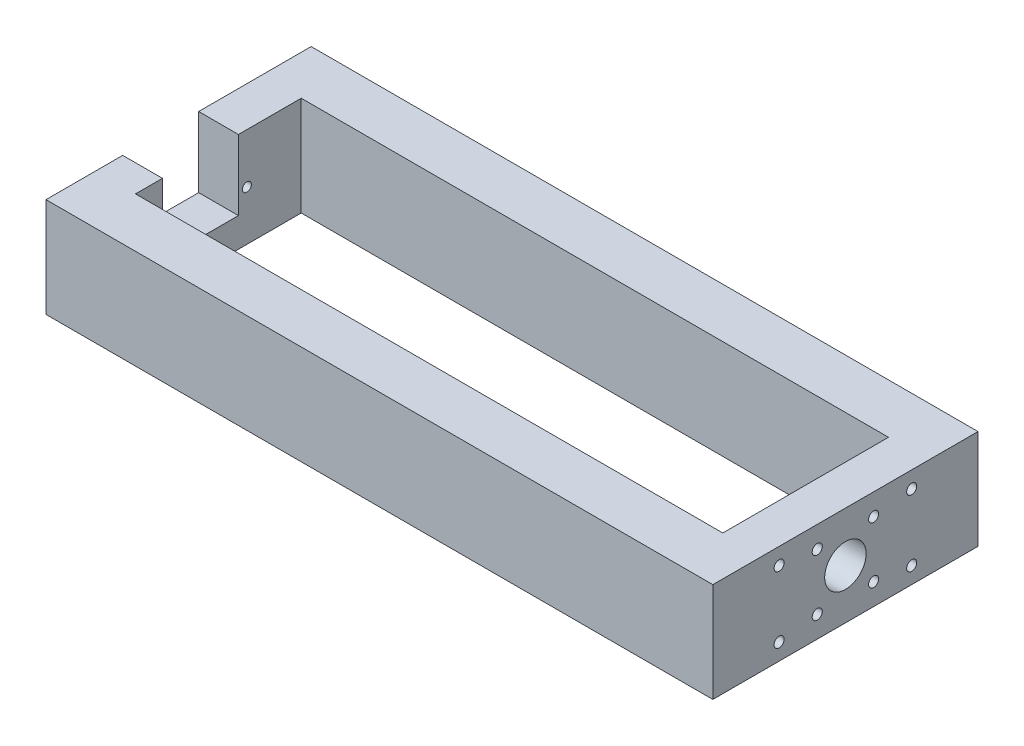
ISO-10303-21;
HEADER;
FILE_DESCRIPTION(('STEP AP214'),'2;1');
FILE_NAME('part.step','',(''),(''),'','','');
FILE_SCHEMA(('AUTOMOTIVE_DESIGN { 1 0 10303 214 1 1 1 1 }'));
ENDSEC;
DATA;
#1=APPLICATION_CONTEXT('core data for automotive mechanical design processes');
#2=APPLICATION_PROTOCOL_DEFINITION('international standard','automotive_design',2000,#1);
#3=PRODUCT_CONTEXT('',#1,'mechanical');
#4=PRODUCT('Part','Part','',(#3));
#5=PRODUCT_RELATED_PRODUCT_CATEGORY('part','',(#4));
#6=PRODUCT_DEFINITION_FORMATION('','',#4);
#7=PRODUCT_DEFINITION_CONTEXT('part definition',#1,'design');
#8=PRODUCT_DEFINITION('design','',#6,#7);
#9=PRODUCT_DEFINITION_SHAPE('','',#8);
#10=(LENGTH_UNIT() NAMED_UNIT(*) SI_UNIT(.MILLI.,.METRE.));
#11=(NAMED_UNIT(*) PLANE_ANGLE_UNIT() SI_UNIT($,.RADIAN.));
#12=(NAMED_UNIT(*) SI_UNIT($,.STERADIAN.) SOLID_ANGLE_UNIT());
#13=UNCERTAINTY_MEASURE_WITH_UNIT(LENGTH_MEASURE(1.E-05),#10,'distance_accuracy_value','');
#14=(GEOMETRIC_REPRESENTATION_CONTEXT(3) GLOBAL_UNCERTAINTY_ASSIGNED_CONTEXT((#13)) GLOBAL_UNIT_ASSIGNED_CONTEXT((#10,
#11,#12)) REPRESENTATION_CONTEXT('',''));
#15=CARTESIAN_POINT('',(0.,0.,0.));
#16=DIRECTION('',(0.,0.,1.));
#17=DIRECTION('',(1.,0.,0.));
#18=AXIS2_PLACEMENT_3D('',#15,#16,#17);
#19=CARTESIAN_POINT('',(0.,30.,0.));
#20=DIRECTION('',(0.,1.,0.));
#21=DIRECTION('',(0.,0.,1.));
#22=AXIS2_PLACEMENT_3D('',#19,#20,#21);
#23=PLANE('',#22);
#24=DIRECTION('',(-1.,0.,0.));
#25=VECTOR('',#24,1.);
#26=CARTESIAN_POINT('',(-39.9651121794872,30.,13.4663381410256));
#27=LINE('',#26,#25);
#28=CARTESIAN_POINT('',(-57.9651121794872,30.,13.4663381410256));
#29=VERTEX_POINT('',#28);
#30=CARTESIAN_POINT('',(-69.9651121794872,30.,13.4663381410256));
#31=VERTEX_POINT('',#30);
#32=EDGE_CURVE('E151',#29,#31,#27,.T.);
#33=ORIENTED_EDGE('',*,*,#32,.F.);
#34=DIRECTION('',(0.,0.,1.));
#35=VECTOR('',#34,1.);
#36=CARTESIAN_POINT('',(-57.9651121794872,30.,-5.47366185897436));
#37=LINE('',#36,#35);
#38=CARTESIAN_POINT('',(-57.9651121794872,30.,-5.47366185897436));
#39=VERTEX_POINT('',#38);
#40=EDGE_CURVE('E174',#39,#29,#37,.T.);
#41=ORIENTED_EDGE('',*,*,#40,.F.);
#42=DIRECTION('',(-1.,0.,0.));
#43=VECTOR('',#42,1.);
#44=CARTESIAN_POINT('',(-57.9651121794872,30.,-5.47366185897436));
#45=LINE('',#44,#43);
#46=CARTESIAN_POINT('',(119.224887820513,30.,-5.47366185897436));
#47=VERTEX_POINT('',#46);
#48=EDGE_CURVE('E185',#47,#39,#45,.T.);
#49=ORIENTED_EDGE('',*,*,#48,.F.);
#50=DIRECTION('',(0.,0.,-1.));
#51=VECTOR('',#50,1.);
#52=CARTESIAN_POINT('',(119.224887820513,30.,-5.47366185897436));
#53=LINE('',#52,#51);
#54=CARTESIAN_POINT('',(119.224887820513,30.,44.5263381410256));
#55=VERTEX_POINT('',#54);
#56=EDGE_CURVE('E182',#55,#47,#53,.T.);
#57=ORIENTED_EDGE('',*,*,#56,.F.);
#58=DIRECTION('',(1.,0.,0.));
#59=VECTOR('',#58,1.);
#60=CARTESIAN_POINT('',(-57.9651121794872,30.,44.5263381410256));
#61=LINE('',#60,#59);
#62=CARTESIAN_POINT('',(-57.9651121794872,30.,44.5263381410256));
#63=VERTEX_POINT('',#62);
#64=EDGE_CURVE('E178',#63,#55,#61,.T.);
#65=ORIENTED_EDGE('',*,*,#64,.F.);
#66=CARTESIAN_POINT('',(-57.9651121794872,30.,36.3863381410256));
#67=VERTEX_POINT('',#66);
#68=EDGE_CURVE('E179',#67,#63,#37,.T.);
#69=ORIENTED_EDGE('',*,*,#68,.F.);
#70=DIRECTION('',(-1.,0.,0.));
#71=VECTOR('',#70,1.);
#72=CARTESIAN_POINT('',(-39.9651121794872,30.,36.3863381410256));
#73=LINE('',#72,#71);
#74=CARTESIAN_POINT('',(-69.9651121794872,30.,36.3863381410256));
#75=VERTEX_POINT('',#74);
#76=EDGE_CURVE('E168',#67,#75,#73,.T.);
#77=ORIENTED_EDGE('',*,*,#76,.T.);
#78=DIRECTION('',(0.,0.,1.));
#79=VECTOR('',#78,1.);
#80=CARTESIAN_POINT('',(-69.9651121794872,30.,-20.4736618589744));
#81=LINE('',#80,#79);
#82=CARTESIAN_POINT('',(-69.9651121794872,30.,59.5263381410256));
#83=VERTEX_POINT('',#82);
#84=EDGE_CURVE('E223',#75,#83,#81,.T.);
#85=ORIENTED_EDGE('',*,*,#84,.T.);
#86=DIRECTION('',(1.,0.,0.));
#87=VECTOR('',#86,1.);
#88=CARTESIAN_POINT('',(-69.9651121794872,30.,59.5263381410256));
#89=LINE('',#88,#87);
#90=CARTESIAN_POINT('',(131.224887820513,30.,59.5263381410256));
#91=VERTEX_POINT('',#90);
#92=EDGE_CURVE('E222',#83,#91,#89,.T.);
#93=ORIENTED_EDGE('',*,*,#92,.T.);
#94=DIRECTION('',(0.,0.,-1.));
#95=VECTOR('',#94,1.);
#96=CARTESIAN_POINT('',(131.224887820513,30.,-20.4736618589744));
#97=LINE('',#96,#95);
#98=CARTESIAN_POINT('',(131.224887820513,30.,-20.4736618589744));
#99=VERTEX_POINT('',#98);
#100=EDGE_CURVE('E226',#91,#99,#97,.T.);
#101=ORIENTED_EDGE('',*,*,#100,.T.);
#102=DIRECTION('',(-1.,0.,0.));
#103=VECTOR('',#102,1.);
#104=CARTESIAN_POINT('',(-69.9651121794872,30.,-20.4736618589744));
#105=LINE('',#104,#103);
#106=CARTESIAN_POINT('',(-69.9651121794872,30.,-20.4736618589744));
#107=VERTEX_POINT('',#106);
#108=EDGE_CURVE('E229',#99,#107,#105,.T.);
#109=ORIENTED_EDGE('',*,*,#108,.T.);
#110=EDGE_CURVE('E219',#107,#31,#81,.T.);
#111=ORIENTED_EDGE('',*,*,#110,.T.);
#112=EDGE_LOOP('',(#33,#41,#49,#57,#65,#69,#77,#85,#93,#101,#109,#111));
#113=FACE_BOUND('',#112,.T.);
#114=ADVANCED_FACE('F45',(#113),#23,.T.);
#115=CARTESIAN_POINT('',(0.,0.,0.));
#116=DIRECTION('',(0.,1.,0.));
#117=DIRECTION('',(0.,0.,1.));
#118=AXIS2_PLACEMENT_3D('',#115,#116,#117);
#119=PLANE('',#118);
#120=DIRECTION('',(0.,0.,1.));
#121=VECTOR('',#120,1.);
#122=CARTESIAN_POINT('',(-69.9651121794872,0.,-20.4736618589744));
#123=LINE('',#122,#121);
#124=CARTESIAN_POINT('',(-69.9651121794872,0.,-20.4736618589744));
#125=VERTEX_POINT('',#124);
#126=CARTESIAN_POINT('',(-69.9651121794872,0.,59.5263381410256));
#127=VERTEX_POINT('',#126);
#128=EDGE_CURVE('E218',#125,#127,#123,.T.);
#129=ORIENTED_EDGE('',*,*,#128,.F.);
#130=DIRECTION('',(-1.,0.,0.));
#131=VECTOR('',#130,1.);
#132=CARTESIAN_POINT('',(-69.9651121794872,0.,-20.4736618589744));
#133=LINE('',#132,#131);
#134=CARTESIAN_POINT('',(131.224887820513,0.,-20.4736618589744));
#135=VERTEX_POINT('',#134);
#136=EDGE_CURVE('E242',#135,#125,#133,.T.);
#137=ORIENTED_EDGE('',*,*,#136,.F.);
#138=DIRECTION('',(0.,0.,-1.));
#139=VECTOR('',#138,1.);
#140=CARTESIAN_POINT('',(131.224887820513,0.,-20.4736618589744));
#141=LINE('',#140,#139);
#142=CARTESIAN_POINT('',(131.224887820513,0.,59.5263381410256));
#143=VERTEX_POINT('',#142);
#144=EDGE_CURVE('E239',#143,#135,#141,.T.);
#145=ORIENTED_EDGE('',*,*,#144,.F.);
#146=DIRECTION('',(1.,0.,0.));
#147=VECTOR('',#146,1.);
#148=CARTESIAN_POINT('',(-69.9651121794872,0.,59.5263381410256));
#149=LINE('',#148,#147);
#150=EDGE_CURVE('E236',#127,#143,#149,.T.);
#151=ORIENTED_EDGE('',*,*,#150,.F.);
#152=EDGE_LOOP('',(#129,#137,#145,#151));
#153=FACE_BOUND('',#152,.T.);
#154=DIRECTION('',(0.,0.,1.));
#155=VECTOR('',#154,1.);
#156=CARTESIAN_POINT('',(-57.9651121794872,0.,-5.47366185897436));
#157=LINE('',#156,#155);
#158=CARTESIAN_POINT('',(-57.9651121794872,0.,-5.47366185897436));
#159=VERTEX_POINT('',#158);
#160=CARTESIAN_POINT('',(-57.9651121794872,0.,44.5263381410256));
#161=VERTEX_POINT('',#160);
#162=EDGE_CURVE('E189',#159,#161,#157,.T.);
#163=ORIENTED_EDGE('',*,*,#162,.T.);
#164=DIRECTION('',(1.,0.,0.));
#165=VECTOR('',#164,1.);
#166=CARTESIAN_POINT('',(-57.9651121794872,0.,44.5263381410256));
#167=LINE('',#166,#165);
#168=CARTESIAN_POINT('',(119.224887820513,0.,44.5263381410256));
#169=VERTEX_POINT('',#168);
#170=EDGE_CURVE('E193',#161,#169,#167,.T.);
#171=ORIENTED_EDGE('',*,*,#170,.T.);
#172=DIRECTION('',(0.,0.,-1.));
#173=VECTOR('',#172,1.);
#174=CARTESIAN_POINT('',(119.224887820513,0.,-5.47366185897436));
#175=LINE('',#174,#173);
#176=CARTESIAN_POINT('',(119.224887820513,0.,-5.47366185897436));
#177=VERTEX_POINT('',#176);
#178=EDGE_CURVE('E198',#169,#177,#175,.T.);
#179=ORIENTED_EDGE('',*,*,#178,.T.);
#180=DIRECTION('',(-1.,0.,0.));
#181=VECTOR('',#180,1.);
#182=CARTESIAN_POINT('',(-57.9651121794872,0.,-5.47366185897436));
#183=LINE('',#182,#181);
#184=EDGE_CURVE('E202',#177,#159,#183,.T.);
#185=ORIENTED_EDGE('',*,*,#184,.T.);
#186=EDGE_LOOP('',(#163,#171,#179,#185));
#187=FACE_BOUND('',#186,.T.);
#188=ADVANCED_FACE('F379',(#153,#187),#119,.F.);
#189=CARTESIAN_POINT('',(-69.9651121794872,30.,-20.4736618589744));
#190=DIRECTION('',(1.,0.,0.));
#191=DIRECTION('',(0.,0.,-1.));
#192=AXIS2_PLACEMENT_3D('',#189,#190,#191);
#193=PLANE('',#192);
#194=CARTESIAN_POINT('',(-69.9651121794872,15.,38.9263381410256));
#195=DIRECTION('',(-1.,0.,0.));
#196=DIRECTION('',(0.,0.,1.));
#197=AXIS2_PLACEMENT_3D('',#194,#195,#196);
#198=CIRCLE('',#197,1.35);
#199=CARTESIAN_POINT('',(-69.9651121794872,15.,40.2763381410256));
#200=VERTEX_POINT('',#199);
#201=EDGE_CURVE('E305',#200,#200,#198,.T.);
#202=ORIENTED_EDGE('',*,*,#201,.F.);
#203=EDGE_LOOP('',(#202));
#204=FACE_BOUND('',#203,.T.);
#205=CARTESIAN_POINT('',(-69.9651121794872,15.,10.9263381410256));
#206=DIRECTION('',(-1.,0.,0.));
#207=DIRECTION('',(0.,0.,1.));
#208=AXIS2_PLACEMENT_3D('',#205,#206,#207);
#209=CIRCLE('',#208,1.35);
#210=CARTESIAN_POINT('',(-69.9651121794872,15.,12.2763381410256));
#211=VERTEX_POINT('',#210);
#212=EDGE_CURVE('E156',#211,#211,#209,.T.);
#213=ORIENTED_EDGE('',*,*,#212,.F.);
#214=EDGE_LOOP('',(#213));
#215=FACE_BOUND('',#214,.T.);
#216=DIRECTION('',(0.,0.,1.));
#217=VECTOR('',#216,1.);
#218=CARTESIAN_POINT('',(-69.9651121794872,8.8,13.4663381410256));
#219=LINE('',#218,#217);
#220=CARTESIAN_POINT('',(-69.9651121794872,8.8,13.4663381410256));
#221=VERTEX_POINT('',#220);
#222=CARTESIAN_POINT('',(-69.9651121794872,8.8,36.3863381410257));
#223=VERTEX_POINT('',#222);
#224=EDGE_CURVE('E138',#221,#223,#219,.T.);
#225=ORIENTED_EDGE('',*,*,#224,.F.);
#226=DIRECTION('',(0.,-1.,0.));
#227=VECTOR('',#226,1.);
#228=CARTESIAN_POINT('',(-69.9651121794872,30.,13.4663381410256));
#229=LINE('',#228,#227);
#230=EDGE_CURVE('E148',#31,#221,#229,.T.);
#231=ORIENTED_EDGE('',*,*,#230,.F.);
#232=ORIENTED_EDGE('',*,*,#110,.F.);
#233=DIRECTION('',(0.,-1.,0.));
#234=VECTOR('',#233,1.);
#235=CARTESIAN_POINT('',(-69.9651121794872,30.,-20.4736618589744));
#236=LINE('',#235,#234);
#237=EDGE_CURVE('E232',#107,#125,#236,.T.);
#238=ORIENTED_EDGE('',*,*,#237,.T.);
#239=ORIENTED_EDGE('',*,*,#128,.T.);
#240=DIRECTION('',(0.,-1.,0.));
#241=VECTOR('',#240,1.);
#242=CARTESIAN_POINT('',(-69.9651121794872,30.,59.5263381410256));
#243=LINE('',#242,#241);
#244=EDGE_CURVE('E256',#83,#127,#243,.T.);
#245=ORIENTED_EDGE('',*,*,#244,.F.);
#246=ORIENTED_EDGE('',*,*,#84,.F.);
#247=DIRECTION('',(0.,1.,0.));
#248=VECTOR('',#247,1.);
#249=CARTESIAN_POINT('',(-69.9651121794872,30.,36.3863381410256));
#250=LINE('',#249,#248);
#251=EDGE_CURVE('E145',#223,#75,#250,.T.);
#252=ORIENTED_EDGE('',*,*,#251,.F.);
#253=EDGE_LOOP('',(#225,#231,#232,#238,#239,#245,#246,#252));
#254=FACE_BOUND('',#253,.T.);
#255=ADVANCED_FACE('F47',(#204,#215,#254),#193,.F.);
#256=CARTESIAN_POINT('',(-69.9651121794872,30.,59.5263381410256));
#257=DIRECTION('',(0.,0.,-1.));
#258=DIRECTION('',(-1.,0.,0.));
#259=AXIS2_PLACEMENT_3D('',#256,#257,#258);
#260=PLANE('',#259);
#261=ORIENTED_EDGE('',*,*,#150,.T.);
#262=DIRECTION('',(0.,-1.,0.));
#263=VECTOR('',#262,1.);
#264=CARTESIAN_POINT('',(131.224887820513,30.,59.5263381410256));
#265=LINE('',#264,#263);
#266=EDGE_CURVE('E252',#91,#143,#265,.T.);
#267=ORIENTED_EDGE('',*,*,#266,.F.);
#268=ORIENTED_EDGE('',*,*,#92,.F.);
#269=ORIENTED_EDGE('',*,*,#244,.T.);
#270=EDGE_LOOP('',(#261,#267,#268,#269));
#271=FACE_BOUND('',#270,.T.);
#272=ADVANCED_FACE('F358',(#271),#260,.F.);
#273=CARTESIAN_POINT('',(131.224887820513,30.,-20.4736618589744));
#274=DIRECTION('',(-1.,0.,0.));
#275=DIRECTION('',(0.,0.,1.));
#276=AXIS2_PLACEMENT_3D('',#273,#274,#275);
#277=PLANE('',#276);
#278=CARTESIAN_POINT('',(131.224887820513,6.50000000000018,11.0263381410255));
#279=DIRECTION('',(1.,0.,0.));
#280=DIRECTION('',(0.,0.,-1.));
#281=AXIS2_PLACEMENT_3D('',#278,#279,#280);
#282=CIRCLE('',#281,1.52);
#283=CARTESIAN_POINT('',(131.224887820513,6.50000000000018,9.50633814102547));
#284=VERTEX_POINT('',#283);
#285=EDGE_CURVE('E328',#284,#284,#282,.T.);
#286=ORIENTED_EDGE('',*,*,#285,.F.);
#287=EDGE_LOOP('',(#286));
#288=FACE_BOUND('',#287,.T.);
#289=CARTESIAN_POINT('',(131.224887820513,23.5000000000002,11.0263381410256));
#290=DIRECTION('',(1.,0.,0.));
#291=DIRECTION('',(0.,0.,-1.));
#292=AXIS2_PLACEMENT_3D('',#289,#290,#291);
#293=CIRCLE('',#292,1.52);
#294=CARTESIAN_POINT('',(131.224887820513,23.5000000000002,9.50633814102562));
#295=VERTEX_POINT('',#294);
#296=EDGE_CURVE('E324',#295,#295,#293,.T.);
#297=ORIENTED_EDGE('',*,*,#296,.F.);
#298=EDGE_LOOP('',(#297));
#299=FACE_BOUND('',#298,.T.);
#300=CARTESIAN_POINT('',(131.224887820513,25.,-0.473661858974354));
#301=DIRECTION('',(1.,0.,0.));
#302=DIRECTION('',(0.,0.,-1.));
#303=AXIS2_PLACEMENT_3D('',#300,#301,#302);
#304=CIRCLE('',#303,1.52);
#305=CARTESIAN_POINT('',(131.224887820513,25.,-1.99366185897436));
#306=VERTEX_POINT('',#305);
#307=EDGE_CURVE('E320',#306,#306,#304,.T.);
#308=ORIENTED_EDGE('',*,*,#307,.F.);
#309=EDGE_LOOP('',(#308));
#310=FACE_BOUND('',#309,.T.);
#311=CARTESIAN_POINT('',(131.224887820513,23.5,28.0263381410256));
#312=DIRECTION('',(1.,0.,0.));
#313=DIRECTION('',(0.,0.,-1.));
#314=AXIS2_PLACEMENT_3D('',#311,#312,#313);
#315=CIRCLE('',#314,1.52);
#316=CARTESIAN_POINT('',(131.224887820513,23.5,26.5063381410256));
#317=VERTEX_POINT('',#316);
#318=EDGE_CURVE('E319',#317,#317,#315,.T.);
#319=ORIENTED_EDGE('',*,*,#318,.F.);
#320=EDGE_LOOP('',(#319));
#321=FACE_BOUND('',#320,.T.);
#322=CARTESIAN_POINT('',(131.224887820513,6.50000000000008,28.0263381410255));
#323=DIRECTION('',(1.,0.,0.));
#324=DIRECTION('',(0.,0.,-1.));
#325=AXIS2_PLACEMENT_3D('',#322,#323,#324);
#326=CIRCLE('',#325,1.52);
#327=CARTESIAN_POINT('',(131.224887820513,6.50000000000008,26.5063381410255));
#328=VERTEX_POINT('',#327);
#329=EDGE_CURVE('E332',#328,#328,#326,.T.);
#330=ORIENTED_EDGE('',*,*,#329,.F.);
#331=EDGE_LOOP('',(#330));
#332=FACE_BOUND('',#331,.T.);
#333=CARTESIAN_POINT('',(131.224887820513,5.,-0.473661858974354));
#334=DIRECTION('',(1.,0.,0.));
#335=DIRECTION('',(0.,0.,-1.));
#336=AXIS2_PLACEMENT_3D('',#333,#334,#335);
#337=CIRCLE('',#336,1.52);
#338=CARTESIAN_POINT('',(131.224887820513,5.,-1.99366185897435));
#339=VERTEX_POINT('',#338);
#340=EDGE_CURVE('E344',#339,#339,#337,.T.);
#341=ORIENTED_EDGE('',*,*,#340,.F.);
#342=EDGE_LOOP('',(#341));
#343=FACE_BOUND('',#342,.T.);
#344=CARTESIAN_POINT('',(131.224887820513,4.99999999999786,39.5263381410246));
#345=DIRECTION('',(1.,0.,0.));
#346=DIRECTION('',(0.,0.,-1.));
#347=AXIS2_PLACEMENT_3D('',#344,#345,#346);
#348=CIRCLE('',#347,1.52);
#349=CARTESIAN_POINT('',(131.224887820513,4.99999999999786,38.0063381410246));
#350=VERTEX_POINT('',#349);
#351=EDGE_CURVE('E340',#350,#350,#348,.T.);
#352=ORIENTED_EDGE('',*,*,#351,.F.);
#353=EDGE_LOOP('',(#352));
#354=FACE_BOUND('',#353,.T.);
#355=CARTESIAN_POINT('',(131.224887820513,24.9999999999979,39.5263381410267));
#356=DIRECTION('',(1.,0.,0.));
#357=DIRECTION('',(0.,0.,-1.));
#358=AXIS2_PLACEMENT_3D('',#355,#356,#357);
#359=CIRCLE('',#358,1.51999999999787);
#360=CARTESIAN_POINT('',(131.224887820513,24.9999999999979,38.0063381410288));
#361=VERTEX_POINT('',#360);
#362=EDGE_CURVE('E336',#361,#361,#359,.T.);
#363=ORIENTED_EDGE('',*,*,#362,.F.);
#364=EDGE_LOOP('',(#363));
#365=FACE_BOUND('',#364,.T.);
#366=CARTESIAN_POINT('',(131.224887820513,15.,19.5263381410256));
#367=DIRECTION('',(1.,0.,0.));
#368=DIRECTION('',(0.,0.,-1.));
#369=AXIS2_PLACEMENT_3D('',#366,#367,#368);
#370=CIRCLE('',#369,6.25);
#371=CARTESIAN_POINT('',(131.224887820513,15.,13.2763381410256));
#372=VERTEX_POINT('',#371);
#373=EDGE_CURVE('E275',#372,#372,#370,.T.);
#374=ORIENTED_EDGE('',*,*,#373,.F.);
#375=EDGE_LOOP('',(#374));
#376=FACE_BOUND('',#375,.T.);
#377=ORIENTED_EDGE('',*,*,#144,.T.);
#378=DIRECTION('',(0.,-1.,0.));
#379=VECTOR('',#378,1.);
#380=CARTESIAN_POINT('',(131.224887820513,30.,-20.4736618589744));
#381=LINE('',#380,#379);
#382=EDGE_CURVE('E248',#99,#135,#381,.T.);
#383=ORIENTED_EDGE('',*,*,#382,.F.);
#384=ORIENTED_EDGE('',*,*,#100,.F.);
#385=ORIENTED_EDGE('',*,*,#266,.T.);
#386=EDGE_LOOP('',(#377,#383,#384,#385));
#387=FACE_BOUND('',#386,.T.);
#388=ADVANCED_FACE('F354',(#288,#299,#310,#321,#332,#343,#354,#365,#376,#387),#277,.F.);
#389=CARTESIAN_POINT('',(-69.9651121794872,30.,-20.4736618589744));
#390=DIRECTION('',(0.,0.,1.));
#391=DIRECTION('',(1.,0.,0.));
#392=AXIS2_PLACEMENT_3D('',#389,#390,#391);
#393=PLANE('',#392);
#394=ORIENTED_EDGE('',*,*,#136,.T.);
#395=ORIENTED_EDGE('',*,*,#237,.F.);
#396=ORIENTED_EDGE('',*,*,#108,.F.);
#397=ORIENTED_EDGE('',*,*,#382,.T.);
#398=EDGE_LOOP('',(#394,#395,#396,#397));
#399=FACE_BOUND('',#398,.T.);
#400=ADVANCED_FACE('F357',(#399),#393,.F.);
#401=CARTESIAN_POINT('',(-57.9651121794872,30.,-5.47366185897436));
#402=DIRECTION('',(1.,0.,0.));
#403=DIRECTION('',(0.,0.,-1.));
#404=AXIS2_PLACEMENT_3D('',#401,#402,#403);
#405=PLANE('',#404);
#406=CARTESIAN_POINT('',(-57.9651121794872,15.,38.9263381410256));
#407=DIRECTION('',(1.,0.,0.));
#408=DIRECTION('',(0.,0.,-1.));
#409=AXIS2_PLACEMENT_3D('',#406,#407,#408);
#410=CIRCLE('',#409,1.35);
#411=CARTESIAN_POINT('',(-57.9651121794872,15.,37.5763381410256));
#412=VERTEX_POINT('',#411);
#413=EDGE_CURVE('E194',#412,#412,#410,.T.);
#414=ORIENTED_EDGE('',*,*,#413,.F.);
#415=EDGE_LOOP('',(#414));
#416=FACE_BOUND('',#415,.T.);
#417=CARTESIAN_POINT('',(-57.9651121794872,15.,10.9263381410256));
#418=DIRECTION('',(1.,0.,0.));
#419=DIRECTION('',(0.,0.,-1.));
#420=AXIS2_PLACEMENT_3D('',#417,#418,#419);
#421=CIRCLE('',#420,1.35);
#422=CARTESIAN_POINT('',(-57.9651121794872,15.,9.57633814102564));
#423=VERTEX_POINT('',#422);
#424=EDGE_CURVE('E167',#423,#423,#421,.T.);
#425=ORIENTED_EDGE('',*,*,#424,.F.);
#426=EDGE_LOOP('',(#425));
#427=FACE_BOUND('',#426,.T.);
#428=DIRECTION('',(0.,1.,0.));
#429=VECTOR('',#428,1.);
#430=CARTESIAN_POINT('',(-57.9651121794872,30.,13.4663381410256));
#431=LINE('',#430,#429);
#432=CARTESIAN_POINT('',(-57.9651121794872,8.8,13.4663381410256));
#433=VERTEX_POINT('',#432);
#434=EDGE_CURVE('E11',#433,#29,#431,.T.);
#435=ORIENTED_EDGE('',*,*,#434,.F.);
#436=DIRECTION('',(0.,0.,-1.));
#437=VECTOR('',#436,1.);
#438=CARTESIAN_POINT('',(-57.9651121794872,8.8,-5.47366185897436));
#439=LINE('',#438,#437);
#440=CARTESIAN_POINT('',(-57.9651121794872,8.8,36.3863381410257));
#441=VERTEX_POINT('',#440);
#442=EDGE_CURVE('E141',#441,#433,#439,.T.);
#443=ORIENTED_EDGE('',*,*,#442,.F.);
#444=DIRECTION('',(0.,-1.,0.));
#445=VECTOR('',#444,1.);
#446=CARTESIAN_POINT('',(-57.9651121794872,30.,36.3863381410256));
#447=LINE('',#446,#445);
#448=EDGE_CURVE('E55',#67,#441,#447,.T.);
#449=ORIENTED_EDGE('',*,*,#448,.F.);
#450=ORIENTED_EDGE('',*,*,#68,.T.);
#451=DIRECTION('',(0.,-1.,0.));
#452=VECTOR('',#451,1.);
#453=CARTESIAN_POINT('',(-57.9651121794872,30.,44.5263381410256));
#454=LINE('',#453,#452);
#455=EDGE_CURVE('E214',#63,#161,#454,.T.);
#456=ORIENTED_EDGE('',*,*,#455,.T.);
#457=ORIENTED_EDGE('',*,*,#162,.F.);
#458=DIRECTION('',(0.,-1.,0.));
#459=VECTOR('',#458,1.);
#460=CARTESIAN_POINT('',(-57.9651121794872,30.,-5.47366185897436));
#461=LINE('',#460,#459);
#462=EDGE_CURVE('E188',#39,#159,#461,.T.);
#463=ORIENTED_EDGE('',*,*,#462,.F.);
#464=ORIENTED_EDGE('',*,*,#40,.T.);
#465=EDGE_LOOP('',(#435,#443,#449,#450,#456,#457,#463,#464));
#466=FACE_BOUND('',#465,.T.);
#467=ADVANCED_FACE('F400',(#416,#427,#466),#405,.T.);
#468=CARTESIAN_POINT('',(-57.9651121794872,30.,44.5263381410256));
#469=DIRECTION('',(0.,0.,-1.));
#470=DIRECTION('',(-1.,0.,0.));
#471=AXIS2_PLACEMENT_3D('',#468,#469,#470);
#472=PLANE('',#471);
#473=ORIENTED_EDGE('',*,*,#170,.F.);
#474=ORIENTED_EDGE('',*,*,#455,.F.);
#475=ORIENTED_EDGE('',*,*,#64,.T.);
#476=DIRECTION('',(0.,-1.,0.));
#477=VECTOR('',#476,1.);
#478=CARTESIAN_POINT('',(119.224887820513,30.,44.5263381410256));
#479=LINE('',#478,#477);
#480=EDGE_CURVE('E211',#55,#169,#479,.T.);
#481=ORIENTED_EDGE('',*,*,#480,.T.);
#482=EDGE_LOOP('',(#473,#474,#475,#481));
#483=FACE_BOUND('',#482,.T.);
#484=ADVANCED_FACE('F407',(#483),#472,.T.);
#485=CARTESIAN_POINT('',(119.224887820513,30.,-5.47366185897436));
#486=DIRECTION('',(-1.,0.,0.));
#487=DIRECTION('',(0.,0.,1.));
#488=AXIS2_PLACEMENT_3D('',#485,#486,#487);
#489=PLANE('',#488);
#490=CARTESIAN_POINT('',(119.224887820513,6.50000000000018,11.0263381410255));
#491=DIRECTION('',(-1.,0.,0.));
#492=DIRECTION('',(0.,0.,1.));
#493=AXIS2_PLACEMENT_3D('',#490,#491,#492);
#494=CIRCLE('',#493,1.52);
#495=CARTESIAN_POINT('',(119.224887820513,6.50000000000018,12.5463381410255));
#496=VERTEX_POINT('',#495);
#497=EDGE_CURVE('E49',#496,#496,#494,.T.);
#498=ORIENTED_EDGE('',*,*,#497,.F.);
#499=EDGE_LOOP('',(#498));
#500=FACE_BOUND('',#499,.T.);
#501=CARTESIAN_POINT('',(119.224887820513,23.5000000000002,11.0263381410256));
#502=DIRECTION('',(-1.,0.,0.));
#503=DIRECTION('',(0.,0.,1.));
#504=AXIS2_PLACEMENT_3D('',#501,#502,#503);
#505=CIRCLE('',#504,1.52);
#506=CARTESIAN_POINT('',(119.224887820513,23.5000000000002,12.5463381410256));
#507=VERTEX_POINT('',#506);
#508=EDGE_CURVE('E298',#507,#507,#505,.T.);
#509=ORIENTED_EDGE('',*,*,#508,.F.);
#510=EDGE_LOOP('',(#509));
#511=FACE_BOUND('',#510,.T.);
#512=CARTESIAN_POINT('',(119.224887820513,25.,-0.473661858974354));
#513=DIRECTION('',(-1.,0.,0.));
#514=DIRECTION('',(0.,0.,1.));
#515=AXIS2_PLACEMENT_3D('',#512,#513,#514);
#516=CIRCLE('',#515,1.52);
#517=CARTESIAN_POINT('',(119.224887820513,25.,1.04633814102565));
#518=VERTEX_POINT('',#517);
#519=EDGE_CURVE('E295',#518,#518,#516,.T.);
#520=ORIENTED_EDGE('',*,*,#519,.F.);
#521=EDGE_LOOP('',(#520));
#522=FACE_BOUND('',#521,.T.);
#523=CARTESIAN_POINT('',(119.224887820513,23.5,28.0263381410256));
#524=DIRECTION('',(-1.,0.,0.));
#525=DIRECTION('',(0.,0.,1.));
#526=AXIS2_PLACEMENT_3D('',#523,#524,#525);
#527=CIRCLE('',#526,1.52);
#528=CARTESIAN_POINT('',(119.224887820513,23.5,29.5463381410256));
#529=VERTEX_POINT('',#528);
#530=EDGE_CURVE('E291',#529,#529,#527,.T.);
#531=ORIENTED_EDGE('',*,*,#530,.F.);
#532=EDGE_LOOP('',(#531));
#533=FACE_BOUND('',#532,.T.);
#534=CARTESIAN_POINT('',(119.224887820513,6.50000000000008,28.0263381410255));
#535=DIRECTION('',(-1.,0.,0.));
#536=DIRECTION('',(0.,0.,1.));
#537=AXIS2_PLACEMENT_3D('',#534,#535,#536);
#538=CIRCLE('',#537,1.52);
#539=CARTESIAN_POINT('',(119.224887820513,6.50000000000008,29.5463381410255));
#540=VERTEX_POINT('',#539);
#541=EDGE_CURVE('E287',#540,#540,#538,.T.);
#542=ORIENTED_EDGE('',*,*,#541,.F.);
#543=EDGE_LOOP('',(#542));
#544=FACE_BOUND('',#543,.T.);
#545=CARTESIAN_POINT('',(119.224887820513,5.,-0.473661858974354));
#546=DIRECTION('',(-1.,0.,0.));
#547=DIRECTION('',(0.,0.,1.));
#548=AXIS2_PLACEMENT_3D('',#545,#546,#547);
#549=CIRCLE('',#548,1.52);
#550=CARTESIAN_POINT('',(119.224887820513,5.,1.04633814102565));
#551=VERTEX_POINT('',#550);
#552=EDGE_CURVE('E283',#551,#551,#549,.T.);
#553=ORIENTED_EDGE('',*,*,#552,.F.);
#554=EDGE_LOOP('',(#553));
#555=FACE_BOUND('',#554,.T.);
#556=CARTESIAN_POINT('',(119.224887820513,4.99999999999786,39.5263381410246));
#557=DIRECTION('',(-1.,0.,0.));
#558=DIRECTION('',(0.,0.,1.));
#559=AXIS2_PLACEMENT_3D('',#556,#557,#558);
#560=CIRCLE('',#559,1.52);
#561=CARTESIAN_POINT('',(119.224887820513,4.99999999999786,41.0463381410246));
#562=VERTEX_POINT('',#561);
#563=EDGE_CURVE('E279',#562,#562,#560,.T.);
#564=ORIENTED_EDGE('',*,*,#563,.F.);
#565=EDGE_LOOP('',(#564));
#566=FACE_BOUND('',#565,.T.);
#567=CARTESIAN_POINT('',(119.224887820513,24.9999999999979,39.5263381410267));
#568=DIRECTION('',(-1.,0.,0.));
#569=DIRECTION('',(0.,0.,1.));
#570=AXIS2_PLACEMENT_3D('',#567,#568,#569);
#571=CIRCLE('',#570,1.51999999999787);
#572=CARTESIAN_POINT('',(119.224887820513,24.9999999999979,41.0463381410246));
#573=VERTEX_POINT('',#572);
#574=EDGE_CURVE('E274',#573,#573,#571,.T.);
#575=ORIENTED_EDGE('',*,*,#574,.F.);
#576=EDGE_LOOP('',(#575));
#577=FACE_BOUND('',#576,.T.);
#578=CARTESIAN_POINT('',(119.224887820513,15.,19.5263381410256));
#579=DIRECTION('',(-1.,0.,0.));
#580=DIRECTION('',(0.,0.,1.));
#581=AXIS2_PLACEMENT_3D('',#578,#579,#580);
#582=CIRCLE('',#581,6.25);
#583=CARTESIAN_POINT('',(119.224887820513,15.,25.7763381410256));
#584=VERTEX_POINT('',#583);
#585=EDGE_CURVE('E270',#584,#584,#582,.T.);
#586=ORIENTED_EDGE('',*,*,#585,.F.);
#587=EDGE_LOOP('',(#586));
#588=FACE_BOUND('',#587,.T.);
#589=ORIENTED_EDGE('',*,*,#178,.F.);
#590=ORIENTED_EDGE('',*,*,#480,.F.);
#591=ORIENTED_EDGE('',*,*,#56,.T.);
#592=DIRECTION('',(0.,-1.,0.));
#593=VECTOR('',#592,1.);
#594=CARTESIAN_POINT('',(119.224887820513,30.,-5.47366185897436));
#595=LINE('',#594,#593);
#596=EDGE_CURVE('E71',#47,#177,#595,.T.);
#597=ORIENTED_EDGE('',*,*,#596,.T.);
#598=EDGE_LOOP('',(#589,#590,#591,#597));
#599=FACE_BOUND('',#598,.T.);
#600=ADVANCED_FACE('F412',(#500,#511,#522,#533,#544,#555,#566,#577,#588,#599),#489,.T.);
#601=CARTESIAN_POINT('',(-57.9651121794872,30.,-5.47366185897436));
#602=DIRECTION('',(0.,0.,1.));
#603=DIRECTION('',(1.,0.,0.));
#604=AXIS2_PLACEMENT_3D('',#601,#602,#603);
#605=PLANE('',#604);
#606=ORIENTED_EDGE('',*,*,#184,.F.);
#607=ORIENTED_EDGE('',*,*,#596,.F.);
#608=ORIENTED_EDGE('',*,*,#48,.T.);
#609=ORIENTED_EDGE('',*,*,#462,.T.);
#610=EDGE_LOOP('',(#606,#607,#608,#609));
#611=FACE_BOUND('',#610,.T.);
#612=ADVANCED_FACE('F423',(#611),#605,.T.);
#613=CARTESIAN_POINT('',(-39.9651121794872,30.,13.4663381410256));
#614=DIRECTION('',(0.,0.,-1.));
#615=DIRECTION('',(-1.,0.,0.));
#616=AXIS2_PLACEMENT_3D('',#613,#614,#615);
#617=PLANE('',#616);
#618=ORIENTED_EDGE('',*,*,#434,.T.);
#619=ORIENTED_EDGE('',*,*,#32,.T.);
#620=ORIENTED_EDGE('',*,*,#230,.T.);
#621=DIRECTION('',(-1.,0.,0.));
#622=VECTOR('',#621,1.);
#623=CARTESIAN_POINT('',(-39.9651121794872,8.8,13.4663381410256));
#624=LINE('',#623,#622);
#625=EDGE_CURVE('E134',#433,#221,#624,.T.);
#626=ORIENTED_EDGE('',*,*,#625,.F.);
#627=EDGE_LOOP('',(#618,#619,#620,#626));
#628=FACE_BOUND('',#627,.T.);
#629=ADVANCED_FACE('F149',(#628),#617,.F.);
#630=CARTESIAN_POINT('',(-39.9651121794872,30.,36.3863381410256));
#631=DIRECTION('',(0.,0.,1.));
#632=DIRECTION('',(0.,-1.,0.));
#633=AXIS2_PLACEMENT_3D('',#630,#631,#632);
#634=PLANE('',#633);
#635=ORIENTED_EDGE('',*,*,#448,.T.);
#636=DIRECTION('',(-1.,0.,0.));
#637=VECTOR('',#636,1.);
#638=CARTESIAN_POINT('',(-39.9651121794872,8.8,36.3863381410256));
#639=LINE('',#638,#637);
#640=EDGE_CURVE('E63',#441,#223,#639,.T.);
#641=ORIENTED_EDGE('',*,*,#640,.T.);
#642=ORIENTED_EDGE('',*,*,#251,.T.);
#643=ORIENTED_EDGE('',*,*,#76,.F.);
#644=EDGE_LOOP('',(#635,#641,#642,#643));
#645=FACE_BOUND('',#644,.T.);
#646=ADVANCED_FACE('F432',(#645),#634,.F.);
#647=CARTESIAN_POINT('',(-39.9651121794872,8.8,13.4663381410256));
#648=DIRECTION('',(0.,-1.,0.));
#649=DIRECTION('',(0.,0.,-1.));
#650=AXIS2_PLACEMENT_3D('',#647,#648,#649);
#651=PLANE('',#650);
#652=ORIENTED_EDGE('',*,*,#442,.T.);
#653=ORIENTED_EDGE('',*,*,#625,.T.);
#654=ORIENTED_EDGE('',*,*,#224,.T.);
#655=ORIENTED_EDGE('',*,*,#640,.F.);
#656=EDGE_LOOP('',(#652,#653,#654,#655));
#657=FACE_BOUND('',#656,.T.);
#658=ADVANCED_FACE('F136',(#657),#651,.F.);
#659=CARTESIAN_POINT('',(-39.9651121794872,15.,10.9263381410256));
#660=DIRECTION('',(-1.,0.,0.));
#661=DIRECTION('',(0.,0.,1.));
#662=AXIS2_PLACEMENT_3D('',#659,#660,#661);
#663=CYLINDRICAL_SURFACE('',#662,1.35);
#664=ORIENTED_EDGE('',*,*,#424,.T.);
#665=EDGE_LOOP('',(#664));
#666=FACE_BOUND('',#665,.T.);
#667=ORIENTED_EDGE('',*,*,#212,.T.);
#668=EDGE_LOOP('',(#667));
#669=FACE_BOUND('',#668,.T.);
#670=ADVANCED_FACE('F438',(#666,#669),#663,.F.);
#671=CARTESIAN_POINT('',(-39.9651121794872,15.,38.9263381410256));
#672=DIRECTION('',(-1.,0.,0.));
#673=DIRECTION('',(0.,0.,1.));
#674=AXIS2_PLACEMENT_3D('',#671,#672,#673);
#675=CYLINDRICAL_SURFACE('',#674,1.35);
#676=ORIENTED_EDGE('',*,*,#413,.T.);
#677=EDGE_LOOP('',(#676));
#678=FACE_BOUND('',#677,.T.);
#679=ORIENTED_EDGE('',*,*,#201,.T.);
#680=EDGE_LOOP('',(#679));
#681=FACE_BOUND('',#680,.T.);
#682=ADVANCED_FACE('F442',(#678,#681),#675,.F.);
#683=CARTESIAN_POINT('',(101.224887820513,15.,19.5263381410256));
#684=DIRECTION('',(1.,0.,0.));
#685=DIRECTION('',(0.,0.,-1.));
#686=AXIS2_PLACEMENT_3D('',#683,#684,#685);
#687=CYLINDRICAL_SURFACE('',#686,6.25);
#688=ORIENTED_EDGE('',*,*,#585,.T.);
#689=EDGE_LOOP('',(#688));
#690=FACE_BOUND('',#689,.T.);
#691=ORIENTED_EDGE('',*,*,#373,.T.);
#692=EDGE_LOOP('',(#691));
#693=FACE_BOUND('',#692,.T.);
#694=ADVANCED_FACE('F467',(#690,#693),#687,.F.);
#695=CARTESIAN_POINT('',(101.224887820513,24.9999999999979,39.5263381410267));
#696=DIRECTION('',(1.,0.,0.));
#697=DIRECTION('',(0.,0.,-1.));
#698=AXIS2_PLACEMENT_3D('',#695,#696,#697);
#699=CYLINDRICAL_SURFACE('',#698,1.51999999999787);
#700=ORIENTED_EDGE('',*,*,#574,.T.);
#701=EDGE_LOOP('',(#700));
#702=FACE_BOUND('',#701,.T.);
#703=ORIENTED_EDGE('',*,*,#362,.T.);
#704=EDGE_LOOP('',(#703));
#705=FACE_BOUND('',#704,.T.);
#706=ADVANCED_FACE('F469',(#702,#705),#699,.F.);
#707=CARTESIAN_POINT('',(101.224887820513,4.99999999999786,39.5263381410246));
#708=DIRECTION('',(1.,0.,0.));
#709=DIRECTION('',(0.,0.,-1.));
#710=AXIS2_PLACEMENT_3D('',#707,#708,#709);
#711=CYLINDRICAL_SURFACE('',#710,1.52);
#712=ORIENTED_EDGE('',*,*,#563,.T.);
#713=EDGE_LOOP('',(#712));
#714=FACE_BOUND('',#713,.T.);
#715=ORIENTED_EDGE('',*,*,#351,.T.);
#716=EDGE_LOOP('',(#715));
#717=FACE_BOUND('',#716,.T.);
#718=ADVANCED_FACE('F474',(#714,#717),#711,.F.);
#719=CARTESIAN_POINT('',(101.224887820513,5.,-0.473661858974354));
#720=DIRECTION('',(1.,0.,0.));
#721=DIRECTION('',(0.,0.,-1.));
#722=AXIS2_PLACEMENT_3D('',#719,#720,#721);
#723=CYLINDRICAL_SURFACE('',#722,1.52);
#724=ORIENTED_EDGE('',*,*,#552,.T.);
#725=EDGE_LOOP('',(#724));
#726=FACE_BOUND('',#725,.T.);
#727=ORIENTED_EDGE('',*,*,#340,.T.);
#728=EDGE_LOOP('',(#727));
#729=FACE_BOUND('',#728,.T.);
#730=ADVANCED_FACE('F563',(#726,#729),#723,.F.);
#731=CARTESIAN_POINT('',(101.224887820513,6.50000000000008,28.0263381410255));
#732=DIRECTION('',(1.,0.,0.));
#733=DIRECTION('',(0.,0.,-1.));
#734=AXIS2_PLACEMENT_3D('',#731,#732,#733);
#735=CYLINDRICAL_SURFACE('',#734,1.52);
#736=ORIENTED_EDGE('',*,*,#541,.T.);
#737=EDGE_LOOP('',(#736));
#738=FACE_BOUND('',#737,.T.);
#739=ORIENTED_EDGE('',*,*,#329,.T.);
#740=EDGE_LOOP('',(#739));
#741=FACE_BOUND('',#740,.T.);
#742=ADVANCED_FACE('F352',(#738,#741),#735,.F.);
#743=CARTESIAN_POINT('',(101.224887820513,23.5,28.0263381410256));
#744=DIRECTION('',(1.,0.,0.));
#745=DIRECTION('',(0.,0.,-1.));
#746=AXIS2_PLACEMENT_3D('',#743,#744,#745);
#747=CYLINDRICAL_SURFACE('',#746,1.52);
#748=ORIENTED_EDGE('',*,*,#530,.T.);
#749=EDGE_LOOP('',(#748));
#750=FACE_BOUND('',#749,.T.);
#751=ORIENTED_EDGE('',*,*,#318,.T.);
#752=EDGE_LOOP('',(#751));
#753=FACE_BOUND('',#752,.T.);
#754=ADVANCED_FACE('F580',(#750,#753),#747,.F.);
#755=CARTESIAN_POINT('',(101.224887820513,25.,-0.473661858974354));
#756=DIRECTION('',(1.,0.,0.));
#757=DIRECTION('',(0.,0.,-1.));
#758=AXIS2_PLACEMENT_3D('',#755,#756,#757);
#759=CYLINDRICAL_SURFACE('',#758,1.52);
#760=ORIENTED_EDGE('',*,*,#519,.T.);
#761=EDGE_LOOP('',(#760));
#762=FACE_BOUND('',#761,.T.);
#763=ORIENTED_EDGE('',*,*,#307,.T.);
#764=EDGE_LOOP('',(#763));
#765=FACE_BOUND('',#764,.T.);
#766=ADVANCED_FACE('F480',(#762,#765),#759,.F.);
#767=CARTESIAN_POINT('',(101.224887820513,23.5000000000002,11.0263381410256));
#768=DIRECTION('',(1.,0.,0.));
#769=DIRECTION('',(0.,0.,-1.));
#770=AXIS2_PLACEMENT_3D('',#767,#768,#769);
#771=CYLINDRICAL_SURFACE('',#770,1.52);
#772=ORIENTED_EDGE('',*,*,#508,.T.);
#773=EDGE_LOOP('',(#772));
#774=FACE_BOUND('',#773,.T.);
#775=ORIENTED_EDGE('',*,*,#296,.T.);
#776=EDGE_LOOP('',(#775));
#777=FACE_BOUND('',#776,.T.);
#778=ADVANCED_FACE('F596',(#774,#777),#771,.F.);
#779=CARTESIAN_POINT('',(101.224887820513,6.50000000000018,11.0263381410255));
#780=DIRECTION('',(1.,0.,0.));
#781=DIRECTION('',(0.,0.,-1.));
#782=AXIS2_PLACEMENT_3D('',#779,#780,#781);
#783=CYLINDRICAL_SURFACE('',#782,1.52);
#784=ORIENTED_EDGE('',*,*,#497,.T.);
#785=EDGE_LOOP('',(#784));
#786=FACE_BOUND('',#785,.T.);
#787=ORIENTED_EDGE('',*,*,#285,.T.);
#788=EDGE_LOOP('',(#787));
#789=FACE_BOUND('',#788,.T.);
#790=ADVANCED_FACE('F604',(#786,#789),#783,.F.);
#791=CLOSED_SHELL('',(#114,#188,#255,#272,#388,#400,#467,#484,#600,#612,#629,#646,#658,#670,
#682,#694,#706,#718,#730,#742,#754,#766,#778,#790));
#792=MANIFOLD_SOLID_BREP('B2',#791);
#793=ADVANCED_BREP_SHAPE_REPRESENTATION('',(#18,#792),#14);
#794=SHAPE_DEFINITION_REPRESENTATION(#9,#793);
ENDSEC;
END-ISO-10303-21;
